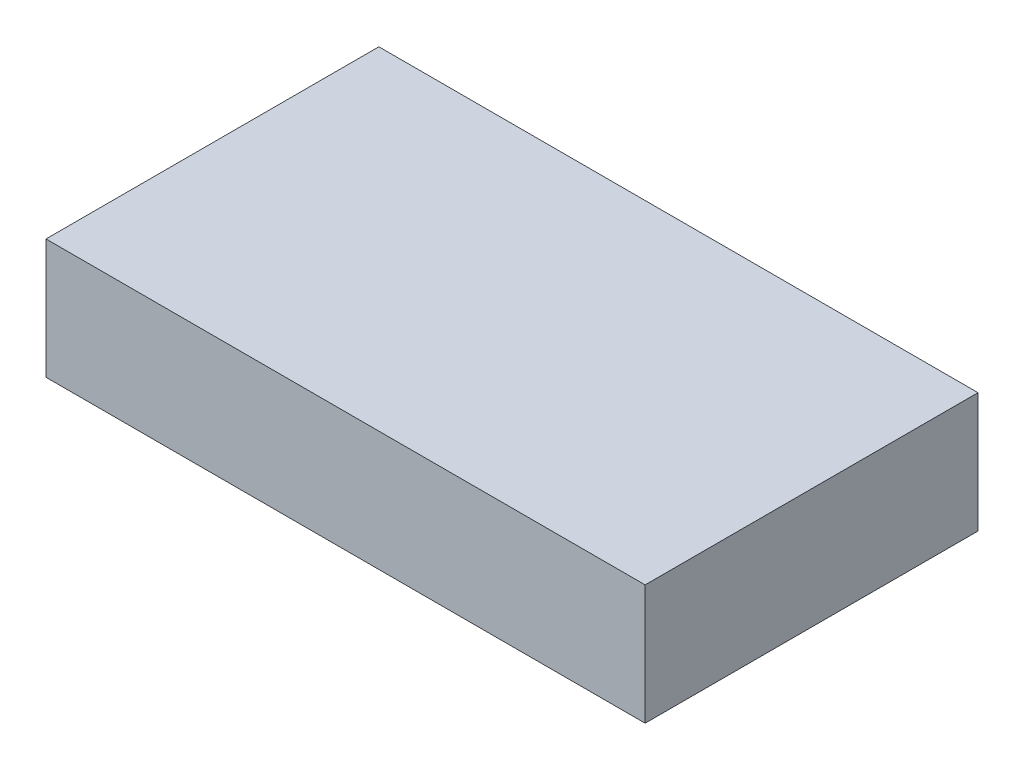
ISO-10303-21;
HEADER;
FILE_DESCRIPTION(('STEP AP214'),'2;1');
FILE_NAME('part.step','',(''),(''),'','','');
FILE_SCHEMA(('AUTOMOTIVE_DESIGN { 1 0 10303 214 1 1 1 1 }'));
ENDSEC;
DATA;
#1=APPLICATION_CONTEXT('core data for automotive mechanical design processes');
#2=APPLICATION_PROTOCOL_DEFINITION('international standard','automotive_design',2000,#1);
#3=PRODUCT_CONTEXT('',#1,'mechanical');
#4=PRODUCT('Part','Part','',(#3));
#5=PRODUCT_RELATED_PRODUCT_CATEGORY('part','',(#4));
#6=PRODUCT_DEFINITION_FORMATION('','',#4);
#7=PRODUCT_DEFINITION_CONTEXT('part definition',#1,'design');
#8=PRODUCT_DEFINITION('design','',#6,#7);
#9=PRODUCT_DEFINITION_SHAPE('','',#8);
#10=(LENGTH_UNIT() NAMED_UNIT(*) SI_UNIT(.MILLI.,.METRE.));
#11=(NAMED_UNIT(*) PLANE_ANGLE_UNIT() SI_UNIT($,.RADIAN.));
#12=(NAMED_UNIT(*) SI_UNIT($,.STERADIAN.) SOLID_ANGLE_UNIT());
#13=UNCERTAINTY_MEASURE_WITH_UNIT(LENGTH_MEASURE(1.E-05),#10,'distance_accuracy_value','');
#14=(GEOMETRIC_REPRESENTATION_CONTEXT(3) GLOBAL_UNCERTAINTY_ASSIGNED_CONTEXT((#13)) GLOBAL_UNIT_ASSIGNED_CONTEXT((#10,
#11,#12)) REPRESENTATION_CONTEXT('',''));
#15=CARTESIAN_POINT('',(0.,0.,0.));
#16=DIRECTION('',(0.,0.,1.));
#17=DIRECTION('',(1.,0.,0.));
#18=AXIS2_PLACEMENT_3D('',#15,#16,#17);
#19=CARTESIAN_POINT('',(22.5,9.,-12.5));
#20=DIRECTION('',(-1.,0.,0.));
#21=DIRECTION('',(0.,0.,1.));
#22=AXIS2_PLACEMENT_3D('',#19,#20,#21);
#23=PLANE('',#22);
#24=DIRECTION('',(0.,0.,-1.));
#25=VECTOR('',#24,1.);
#26=CARTESIAN_POINT('',(22.5,0.,-12.5));
#27=LINE('',#26,#25);
#28=CARTESIAN_POINT('',(22.5,0.,12.5));
#29=VERTEX_POINT('',#28);
#30=CARTESIAN_POINT('',(22.5,0.,-12.5));
#31=VERTEX_POINT('',#30);
#32=EDGE_CURVE('E96',#29,#31,#27,.T.);
#33=ORIENTED_EDGE('',*,*,#32,.T.);
#34=DIRECTION('',(0.,-1.,0.));
#35=VECTOR('',#34,1.);
#36=CARTESIAN_POINT('',(22.5,9.,-12.5));
#37=LINE('',#36,#35);
#38=CARTESIAN_POINT('',(22.5,9.,-12.5));
#39=VERTEX_POINT('',#38);
#40=EDGE_CURVE('E11',#39,#31,#37,.T.);
#41=ORIENTED_EDGE('',*,*,#40,.F.);
#42=DIRECTION('',(0.,0.,-1.));
#43=VECTOR('',#42,1.);
#44=CARTESIAN_POINT('',(22.5,9.,-12.5));
#45=LINE('',#44,#43);
#46=CARTESIAN_POINT('',(22.5,9.,12.5));
#47=VERTEX_POINT('',#46);
#48=EDGE_CURVE('E84',#47,#39,#45,.T.);
#49=ORIENTED_EDGE('',*,*,#48,.F.);
#50=DIRECTION('',(0.,-1.,0.));
#51=VECTOR('',#50,1.);
#52=CARTESIAN_POINT('',(22.5,9.,12.5));
#53=LINE('',#52,#51);
#54=EDGE_CURVE('E92',#47,#29,#53,.T.);
#55=ORIENTED_EDGE('',*,*,#54,.T.);
#56=EDGE_LOOP('',(#33,#41,#49,#55));
#57=FACE_BOUND('',#56,.T.);
#58=ADVANCED_FACE('F33',(#57),#23,.F.);
#59=CARTESIAN_POINT('',(-22.5,9.,-12.5));
#60=DIRECTION('',(0.,0.,1.));
#61=DIRECTION('',(1.,0.,0.));
#62=AXIS2_PLACEMENT_3D('',#59,#60,#61);
#63=PLANE('',#62);
#64=DIRECTION('',(-1.,0.,0.));
#65=VECTOR('',#64,1.);
#66=CARTESIAN_POINT('',(-22.5,0.,-12.5));
#67=LINE('',#66,#65);
#68=CARTESIAN_POINT('',(-22.5,0.,-12.5));
#69=VERTEX_POINT('',#68);
#70=EDGE_CURVE('E88',#31,#69,#67,.T.);
#71=ORIENTED_EDGE('',*,*,#70,.T.);
#72=DIRECTION('',(0.,-1.,0.));
#73=VECTOR('',#72,1.);
#74=CARTESIAN_POINT('',(-22.5,9.,-12.5));
#75=LINE('',#74,#73);
#76=CARTESIAN_POINT('',(-22.5,9.,-12.5));
#77=VERTEX_POINT('',#76);
#78=EDGE_CURVE('E41',#77,#69,#75,.T.);
#79=ORIENTED_EDGE('',*,*,#78,.F.);
#80=DIRECTION('',(-1.,0.,0.));
#81=VECTOR('',#80,1.);
#82=CARTESIAN_POINT('',(-22.5,9.,-12.5));
#83=LINE('',#82,#81);
#84=EDGE_CURVE('E79',#39,#77,#83,.T.);
#85=ORIENTED_EDGE('',*,*,#84,.F.);
#86=ORIENTED_EDGE('',*,*,#40,.T.);
#87=EDGE_LOOP('',(#71,#79,#85,#86));
#88=FACE_BOUND('',#87,.T.);
#89=ADVANCED_FACE('F87',(#88),#63,.F.);
#90=CARTESIAN_POINT('',(-22.5,9.,-12.5));
#91=DIRECTION('',(1.,0.,0.));
#92=DIRECTION('',(0.,0.,-1.));
#93=AXIS2_PLACEMENT_3D('',#90,#91,#92);
#94=PLANE('',#93);
#95=DIRECTION('',(0.,0.,1.));
#96=VECTOR('',#95,1.);
#97=CARTESIAN_POINT('',(-22.5,0.,-12.5));
#98=LINE('',#97,#96);
#99=CARTESIAN_POINT('',(-22.5,0.,12.5));
#100=VERTEX_POINT('',#99);
#101=EDGE_CURVE('E66',#69,#100,#98,.T.);
#102=ORIENTED_EDGE('',*,*,#101,.T.);
#103=DIRECTION('',(0.,-1.,0.));
#104=VECTOR('',#103,1.);
#105=CARTESIAN_POINT('',(-22.5,9.,12.5));
#106=LINE('',#105,#104);
#107=CARTESIAN_POINT('',(-22.5,9.,12.5));
#108=VERTEX_POINT('',#107);
#109=EDGE_CURVE('E89',#108,#100,#106,.T.);
#110=ORIENTED_EDGE('',*,*,#109,.F.);
#111=DIRECTION('',(0.,0.,1.));
#112=VECTOR('',#111,1.);
#113=CARTESIAN_POINT('',(-22.5,9.,-12.5));
#114=LINE('',#113,#112);
#115=EDGE_CURVE('E82',#77,#108,#114,.T.);
#116=ORIENTED_EDGE('',*,*,#115,.F.);
#117=ORIENTED_EDGE('',*,*,#78,.T.);
#118=EDGE_LOOP('',(#102,#110,#116,#117));
#119=FACE_BOUND('',#118,.T.);
#120=ADVANCED_FACE('F90',(#119),#94,.F.);
#121=CARTESIAN_POINT('',(-22.5,9.,12.5));
#122=DIRECTION('',(0.,0.,-1.));
#123=DIRECTION('',(-1.,0.,0.));
#124=AXIS2_PLACEMENT_3D('',#121,#122,#123);
#125=PLANE('',#124);
#126=DIRECTION('',(1.,0.,0.));
#127=VECTOR('',#126,1.);
#128=CARTESIAN_POINT('',(-22.5,0.,12.5));
#129=LINE('',#128,#127);
#130=EDGE_CURVE('E72',#100,#29,#129,.T.);
#131=ORIENTED_EDGE('',*,*,#130,.T.);
#132=ORIENTED_EDGE('',*,*,#54,.F.);
#133=DIRECTION('',(1.,0.,0.));
#134=VECTOR('',#133,1.);
#135=CARTESIAN_POINT('',(-22.5,9.,12.5));
#136=LINE('',#135,#134);
#137=EDGE_CURVE('E49',#108,#47,#136,.T.);
#138=ORIENTED_EDGE('',*,*,#137,.F.);
#139=ORIENTED_EDGE('',*,*,#109,.T.);
#140=EDGE_LOOP('',(#131,#132,#138,#139));
#141=FACE_BOUND('',#140,.T.);
#142=ADVANCED_FACE('F103',(#141),#125,.F.);
#143=CARTESIAN_POINT('',(0.,9.,0.));
#144=DIRECTION('',(0.,1.,0.));
#145=DIRECTION('',(0.,0.,1.));
#146=AXIS2_PLACEMENT_3D('',#143,#144,#145);
#147=PLANE('',#146);
#148=ORIENTED_EDGE('',*,*,#48,.T.);
#149=ORIENTED_EDGE('',*,*,#84,.T.);
#150=ORIENTED_EDGE('',*,*,#115,.T.);
#151=ORIENTED_EDGE('',*,*,#137,.T.);
#152=EDGE_LOOP('',(#148,#149,#150,#151));
#153=FACE_BOUND('',#152,.T.);
#154=ADVANCED_FACE('F80',(#153),#147,.T.);
#155=CARTESIAN_POINT('',(0.,0.,0.));
#156=DIRECTION('',(0.,1.,0.));
#157=DIRECTION('',(0.,0.,1.));
#158=AXIS2_PLACEMENT_3D('',#155,#156,#157);
#159=PLANE('',#158);
#160=ORIENTED_EDGE('',*,*,#32,.F.);
#161=ORIENTED_EDGE('',*,*,#130,.F.);
#162=ORIENTED_EDGE('',*,*,#101,.F.);
#163=ORIENTED_EDGE('',*,*,#70,.F.);
#164=EDGE_LOOP('',(#160,#161,#162,#163));
#165=FACE_BOUND('',#164,.T.);
#166=ADVANCED_FACE('F106',(#165),#159,.F.);
#167=CLOSED_SHELL('',(#58,#89,#120,#142,#154,#166));
#168=MANIFOLD_SOLID_BREP('B2',#167);
#169=ADVANCED_BREP_SHAPE_REPRESENTATION('',(#18,#168),#14);
#170=SHAPE_DEFINITION_REPRESENTATION(#9,#169);
ENDSEC;
END-ISO-10303-21;
